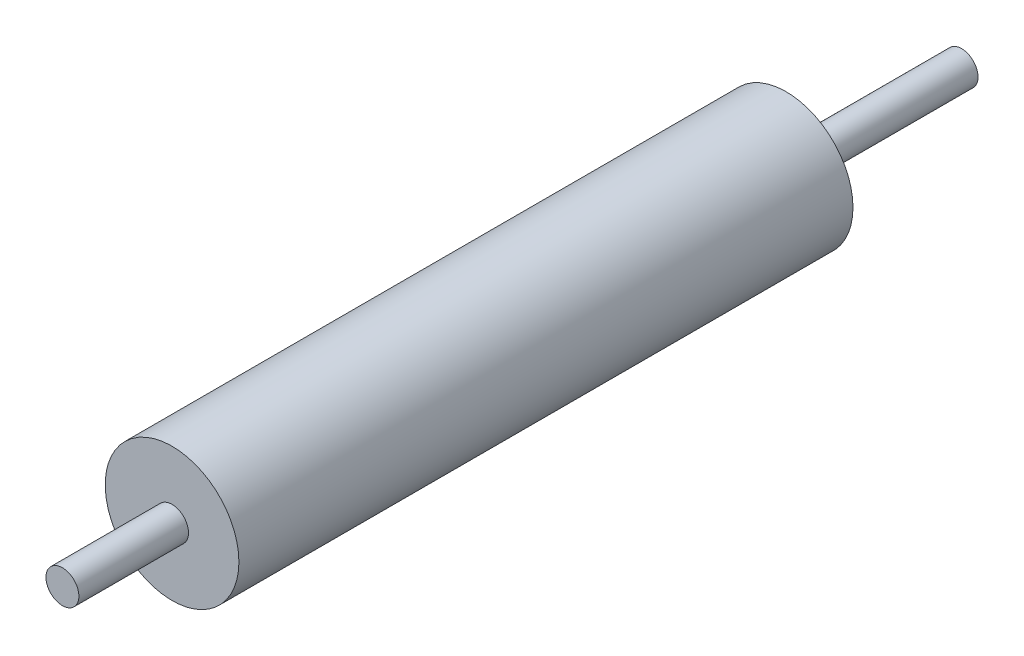
ISO-10303-21;
HEADER;
FILE_DESCRIPTION(('STEP AP214'),'2;1');
FILE_NAME('part.step','',(''),(''),'','','');
FILE_SCHEMA(('AUTOMOTIVE_DESIGN { 1 0 10303 214 1 1 1 1 }'));
ENDSEC;
DATA;
#1=APPLICATION_CONTEXT('core data for automotive mechanical design processes');
#2=APPLICATION_PROTOCOL_DEFINITION('international standard','automotive_design',2000,#1);
#3=PRODUCT_CONTEXT('',#1,'mechanical');
#4=PRODUCT('Part','Part','',(#3));
#5=PRODUCT_RELATED_PRODUCT_CATEGORY('part','',(#4));
#6=PRODUCT_DEFINITION_FORMATION('','',#4);
#7=PRODUCT_DEFINITION_CONTEXT('part definition',#1,'design');
#8=PRODUCT_DEFINITION('design','',#6,#7);
#9=PRODUCT_DEFINITION_SHAPE('','',#8);
#10=(LENGTH_UNIT() NAMED_UNIT(*) SI_UNIT(.MILLI.,.METRE.));
#11=(NAMED_UNIT(*) PLANE_ANGLE_UNIT() SI_UNIT($,.RADIAN.));
#12=(NAMED_UNIT(*) SI_UNIT($,.STERADIAN.) SOLID_ANGLE_UNIT());
#13=UNCERTAINTY_MEASURE_WITH_UNIT(LENGTH_MEASURE(1.E-05),#10,'distance_accuracy_value','');
#14=(GEOMETRIC_REPRESENTATION_CONTEXT(3) GLOBAL_UNCERTAINTY_ASSIGNED_CONTEXT((#13)) GLOBAL_UNIT_ASSIGNED_CONTEXT((#10,
#11,#12)) REPRESENTATION_CONTEXT('',''));
#15=CARTESIAN_POINT('',(0.,0.,0.));
#16=DIRECTION('',(0.,0.,1.));
#17=DIRECTION('',(1.,0.,0.));
#18=AXIS2_PLACEMENT_3D('',#15,#16,#17);
#19=CARTESIAN_POINT('',(0.,0.,280.));
#20=DIRECTION('',(0.,0.,-1.));
#21=DIRECTION('',(-1.,0.,0.));
#22=AXIS2_PLACEMENT_3D('',#19,#20,#21);
#23=CYLINDRICAL_SURFACE('',#22,30.48);
#24=CARTESIAN_POINT('',(0.,0.,280.));
#25=DIRECTION('',(0.,0.,1.));
#26=DIRECTION('',(1.,0.,0.));
#27=AXIS2_PLACEMENT_3D('',#24,#25,#26);
#28=CIRCLE('',#27,30.48);
#29=CARTESIAN_POINT('',(30.48,0.,280.));
#30=VERTEX_POINT('',#29);
#31=EDGE_CURVE('E51',#30,#30,#28,.T.);
#32=ORIENTED_EDGE('',*,*,#31,.F.);
#33=EDGE_LOOP('',(#32));
#34=FACE_BOUND('',#33,.T.);
#35=CARTESIAN_POINT('',(0.,0.,0.));
#36=DIRECTION('',(0.,0.,1.));
#37=DIRECTION('',(1.,0.,0.));
#38=AXIS2_PLACEMENT_3D('',#35,#36,#37);
#39=CIRCLE('',#38,30.48);
#40=CARTESIAN_POINT('',(30.48,0.,0.));
#41=VERTEX_POINT('',#40);
#42=EDGE_CURVE('E40',#41,#41,#39,.T.);
#43=ORIENTED_EDGE('',*,*,#42,.T.);
#44=EDGE_LOOP('',(#43));
#45=FACE_BOUND('',#44,.T.);
#46=ADVANCED_FACE('F37',(#34,#45),#23,.T.);
#47=CARTESIAN_POINT('',(0.,0.,280.));
#48=DIRECTION('',(0.,0.,1.));
#49=DIRECTION('',(1.,0.,0.));
#50=AXIS2_PLACEMENT_3D('',#47,#48,#49);
#51=PLANE('',#50);
#52=CARTESIAN_POINT('',(0.,0.,280.));
#53=DIRECTION('',(0.,0.,1.));
#54=DIRECTION('',(1.,0.,0.));
#55=AXIS2_PLACEMENT_3D('',#52,#53,#54);
#56=CIRCLE('',#55,7.5);
#57=CARTESIAN_POINT('',(7.5,0.,280.));
#58=VERTEX_POINT('',#57);
#59=EDGE_CURVE('E45',#58,#58,#56,.T.);
#60=ORIENTED_EDGE('',*,*,#59,.F.);
#61=EDGE_LOOP('',(#60));
#62=FACE_BOUND('',#61,.T.);
#63=ORIENTED_EDGE('',*,*,#31,.T.);
#64=EDGE_LOOP('',(#63));
#65=FACE_BOUND('',#64,.T.);
#66=ADVANCED_FACE('F71',(#62,#65),#51,.T.);
#67=CARTESIAN_POINT('',(0.,0.,0.));
#68=DIRECTION('',(0.,0.,1.));
#69=DIRECTION('',(1.,0.,0.));
#70=AXIS2_PLACEMENT_3D('',#67,#68,#69);
#71=PLANE('',#70);
#72=CARTESIAN_POINT('',(0.,0.,0.));
#73=DIRECTION('',(0.,0.,-1.));
#74=DIRECTION('',(-1.,0.,0.));
#75=AXIS2_PLACEMENT_3D('',#72,#73,#74);
#76=CIRCLE('',#75,7.5);
#77=CARTESIAN_POINT('',(-7.5,0.,0.));
#78=VERTEX_POINT('',#77);
#79=EDGE_CURVE('E10',#78,#78,#76,.T.);
#80=ORIENTED_EDGE('',*,*,#79,.F.);
#81=EDGE_LOOP('',(#80));
#82=FACE_BOUND('',#81,.T.);
#83=ORIENTED_EDGE('',*,*,#42,.F.);
#84=EDGE_LOOP('',(#83));
#85=FACE_BOUND('',#84,.T.);
#86=ADVANCED_FACE('F68',(#82,#85),#71,.F.);
#87=CARTESIAN_POINT('',(0.,0.,330.));
#88=DIRECTION('',(0.,0.,-1.));
#89=DIRECTION('',(-1.,0.,0.));
#90=AXIS2_PLACEMENT_3D('',#87,#88,#89);
#91=CYLINDRICAL_SURFACE('',#90,7.5);
#92=CARTESIAN_POINT('',(0.,0.,330.));
#93=DIRECTION('',(0.,0.,1.));
#94=DIRECTION('',(1.,0.,0.));
#95=AXIS2_PLACEMENT_3D('',#92,#93,#94);
#96=CIRCLE('',#95,7.5);
#97=CARTESIAN_POINT('',(7.5,0.,330.));
#98=VERTEX_POINT('',#97);
#99=EDGE_CURVE('E56',#98,#98,#96,.T.);
#100=ORIENTED_EDGE('',*,*,#99,.F.);
#101=EDGE_LOOP('',(#100));
#102=FACE_BOUND('',#101,.T.);
#103=ORIENTED_EDGE('',*,*,#59,.T.);
#104=EDGE_LOOP('',(#103));
#105=FACE_BOUND('',#104,.T.);
#106=ADVANCED_FACE('F70',(#102,#105),#91,.T.);
#107=CARTESIAN_POINT('',(0.,0.,330.));
#108=DIRECTION('',(0.,0.,1.));
#109=DIRECTION('',(1.,0.,0.));
#110=AXIS2_PLACEMENT_3D('',#107,#108,#109);
#111=PLANE('',#110);
#112=ORIENTED_EDGE('',*,*,#99,.T.);
#113=EDGE_LOOP('',(#112));
#114=FACE_BOUND('',#113,.T.);
#115=ADVANCED_FACE('F77',(#114),#111,.T.);
#116=CARTESIAN_POINT('',(0.,0.,-80.));
#117=DIRECTION('',(0.,0.,1.));
#118=DIRECTION('',(1.,0.,0.));
#119=AXIS2_PLACEMENT_3D('',#116,#117,#118);
#120=CYLINDRICAL_SURFACE('',#119,7.5);
#121=CARTESIAN_POINT('',(0.,0.,-80.));
#122=DIRECTION('',(0.,0.,-1.));
#123=DIRECTION('',(-1.,0.,0.));
#124=AXIS2_PLACEMENT_3D('',#121,#122,#123);
#125=CIRCLE('',#124,7.5);
#126=CARTESIAN_POINT('',(-7.5,0.,-80.));
#127=VERTEX_POINT('',#126);
#128=EDGE_CURVE('E55',#127,#127,#125,.T.);
#129=ORIENTED_EDGE('',*,*,#128,.F.);
#130=EDGE_LOOP('',(#129));
#131=FACE_BOUND('',#130,.T.);
#132=ORIENTED_EDGE('',*,*,#79,.T.);
#133=EDGE_LOOP('',(#132));
#134=FACE_BOUND('',#133,.T.);
#135=ADVANCED_FACE('F105',(#131,#134),#120,.T.);
#136=CARTESIAN_POINT('',(0.,0.,-80.));
#137=DIRECTION('',(0.,0.,-1.));
#138=DIRECTION('',(-1.,0.,0.));
#139=AXIS2_PLACEMENT_3D('',#136,#137,#138);
#140=PLANE('',#139);
#141=ORIENTED_EDGE('',*,*,#128,.T.);
#142=EDGE_LOOP('',(#141));
#143=FACE_BOUND('',#142,.T.);
#144=ADVANCED_FACE('F119',(#143),#140,.T.);
#145=CLOSED_SHELL('',(#46,#66,#86,#106,#115,#135,#144));
#146=MANIFOLD_SOLID_BREP('B2',#145);
#147=ADVANCED_BREP_SHAPE_REPRESENTATION('',(#18,#146),#14);
#148=SHAPE_DEFINITION_REPRESENTATION(#9,#147);
ENDSEC;
END-ISO-10303-21;
